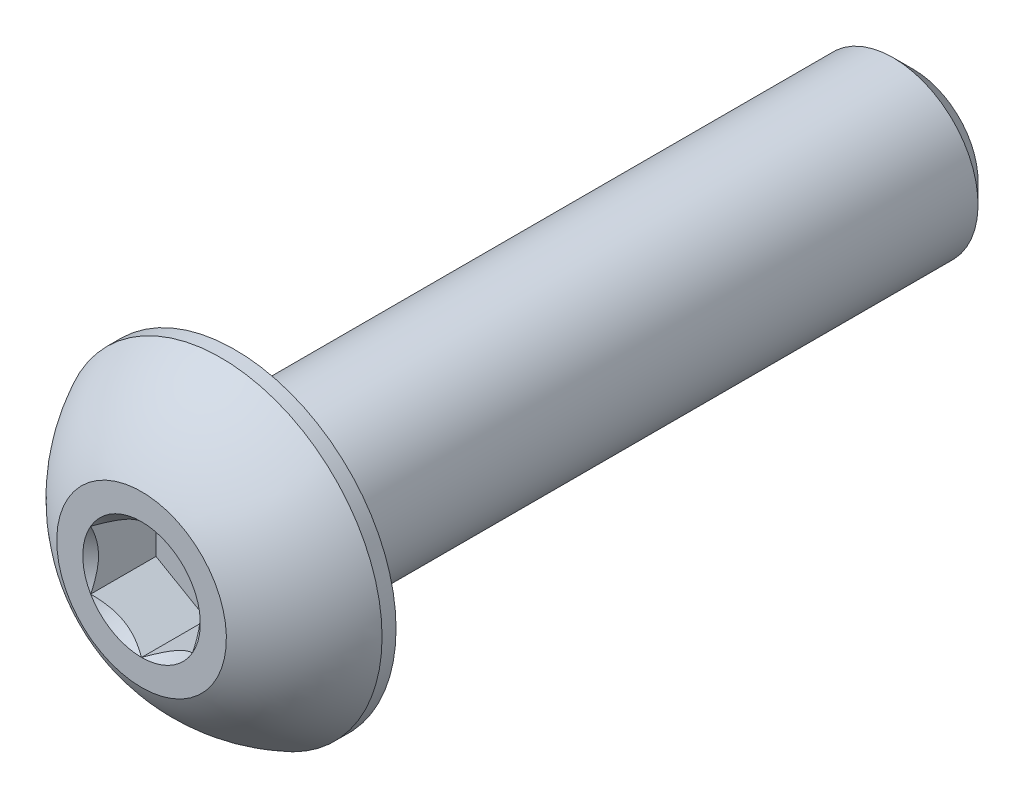
ISO-10303-21;
HEADER;
FILE_DESCRIPTION(('STEP AP214'),'2;1');
FILE_NAME('part.step','',(''),(''),'','','');
FILE_SCHEMA(('AUTOMOTIVE_DESIGN { 1 0 10303 214 1 1 1 1 }'));
ENDSEC;
DATA;
#1=APPLICATION_CONTEXT('core data for automotive mechanical design processes');
#2=APPLICATION_PROTOCOL_DEFINITION('international standard','automotive_design',2000,#1);
#3=PRODUCT_CONTEXT('',#1,'mechanical');
#4=PRODUCT('Part','Part','',(#3));
#5=PRODUCT_RELATED_PRODUCT_CATEGORY('part','',(#4));
#6=PRODUCT_DEFINITION_FORMATION('','',#4);
#7=PRODUCT_DEFINITION_CONTEXT('part definition',#1,'design');
#8=PRODUCT_DEFINITION('design','',#6,#7);
#9=PRODUCT_DEFINITION_SHAPE('','',#8);
#10=(LENGTH_UNIT() NAMED_UNIT(*) SI_UNIT(.MILLI.,.METRE.));
#11=(NAMED_UNIT(*) PLANE_ANGLE_UNIT() SI_UNIT($,.RADIAN.));
#12=(NAMED_UNIT(*) SI_UNIT($,.STERADIAN.) SOLID_ANGLE_UNIT());
#13=UNCERTAINTY_MEASURE_WITH_UNIT(LENGTH_MEASURE(1.E-05),#10,'distance_accuracy_value','');
#14=(GEOMETRIC_REPRESENTATION_CONTEXT(3) GLOBAL_UNCERTAINTY_ASSIGNED_CONTEXT((#13)) GLOBAL_UNIT_ASSIGNED_CONTEXT((#10,
#11,#12)) REPRESENTATION_CONTEXT('',''));
#15=CARTESIAN_POINT('',(0.,0.,0.));
#16=DIRECTION('',(0.,0.,1.));
#17=DIRECTION('',(1.,0.,0.));
#18=AXIS2_PLACEMENT_3D('',#15,#16,#17);
#19=CARTESIAN_POINT('',(0.,-2.5,-22.75));
#20=DIRECTION('',(0.,0.,-1.));
#21=DIRECTION('',(0.,1.,0.));
#22=AXIS2_PLACEMENT_3D('',#19,#20,#21);
#23=PLANE('',#22);
#24=CARTESIAN_POINT('',(0.,0.,-22.75));
#25=DIRECTION('',(0.,0.,-1.));
#26=DIRECTION('',(0.,1.,0.));
#27=AXIS2_PLACEMENT_3D('',#24,#25,#26);
#28=CIRCLE('',#27,1.9);
#29=CARTESIAN_POINT('',(0.,1.9,-22.75));
#30=VERTEX_POINT('',#29);
#31=EDGE_CURVE('E175',#30,#30,#28,.T.);
#32=ORIENTED_EDGE('',*,*,#31,.T.);
#33=EDGE_LOOP('',(#32));
#34=FACE_BOUND('',#33,.T.);
#35=ADVANCED_FACE('F35',(#34),#23,.T.);
#36=CARTESIAN_POINT('',(0.,0.,-22.75));
#37=DIRECTION('',(0.,0.,-1.));
#38=DIRECTION('',(0.,1.,0.));
#39=AXIS2_PLACEMENT_3D('',#36,#37,#38);
#40=CYLINDRICAL_SURFACE('',#39,2.5);
#41=CARTESIAN_POINT('',(0.,0.,-22.15));
#42=DIRECTION('',(0.,0.,-1.));
#43=DIRECTION('',(0.,1.,0.));
#44=AXIS2_PLACEMENT_3D('',#41,#42,#43);
#45=CIRCLE('',#44,2.5);
#46=CARTESIAN_POINT('',(0.,2.5,-22.15));
#47=VERTEX_POINT('',#46);
#48=EDGE_CURVE('E49',#47,#47,#45,.F.);
#49=ORIENTED_EDGE('',*,*,#48,.T.);
#50=EDGE_LOOP('',(#49));
#51=FACE_BOUND('',#50,.T.);
#52=CARTESIAN_POINT('',(0.,0.,-2.75));
#53=DIRECTION('',(0.,0.,1.));
#54=DIRECTION('',(1.,0.,0.));
#55=AXIS2_PLACEMENT_3D('',#52,#53,#54);
#56=CIRCLE('',#55,2.5);
#57=CARTESIAN_POINT('',(2.5,0.,-2.75));
#58=VERTEX_POINT('',#57);
#59=EDGE_CURVE('E172',#58,#58,#56,.F.);
#60=ORIENTED_EDGE('',*,*,#59,.T.);
#61=EDGE_LOOP('',(#60));
#62=FACE_BOUND('',#61,.T.);
#63=ADVANCED_FACE('F180',(#51,#62),#40,.T.);
#64=CARTESIAN_POINT('',(0.,0.,-22.75));
#65=DIRECTION('',(0.,0.,1.));
#66=DIRECTION('',(0.,-1.,0.));
#67=AXIS2_PLACEMENT_3D('',#64,#65,#66);
#68=CONICAL_SURFACE('',#67,1.9,0.785398163397447);
#69=ORIENTED_EDGE('',*,*,#48,.F.);
#70=EDGE_LOOP('',(#69));
#71=FACE_BOUND('',#70,.T.);
#72=ORIENTED_EDGE('',*,*,#31,.F.);
#73=EDGE_LOOP('',(#72));
#74=FACE_BOUND('',#73,.T.);
#75=ADVANCED_FACE('F37',(#71,#74),#68,.T.);
#76=CARTESIAN_POINT('',(0.,0.,-4.65805481283422));
#77=DIRECTION('',(0.,0.,1.));
#78=DIRECTION('',(0.,-1.,0.));
#79=AXIS2_PLACEMENT_3D('',#76,#77,#78);
#80=SPHERICAL_SURFACE('',#79,5.28653711226622);
#81=CARTESIAN_POINT('',(0.,0.,0.));
#82=DIRECTION('',(0.,0.,1.));
#83=DIRECTION('',(1.,0.,0.));
#84=AXIS2_PLACEMENT_3D('',#81,#82,#83);
#85=CIRCLE('',#84,2.5);
#86=CARTESIAN_POINT('',(0.,-2.5,0.));
#87=VERTEX_POINT('',#86);
#88=EDGE_CURVE('E169',#87,#87,#85,.T.);
#89=CARTESIAN_POINT('',(0.,0.,-2.3375));
#90=DIRECTION('',(0.,0.,1.));
#91=DIRECTION('',(1.,0.,0.));
#92=AXIS2_PLACEMENT_3D('',#89,#90,#91);
#93=CIRCLE('',#92,4.75);
#94=CARTESIAN_POINT('',(0.,-4.75,-2.3375));
#95=VERTEX_POINT('',#94);
#96=EDGE_CURVE('E163',#95,#95,#93,.T.);
#97=CARTESIAN_POINT('',(0.,-2.5,0.));
#98=CARTESIAN_POINT('',(0.,-2.53026679982017,-0.016244282455609));
#99=CARTESIAN_POINT('',(0.,-2.56037522904968,-0.0327836412064128));
#100=CARTESIAN_POINT('',(0.,-2.62026400427657,-0.0664460518821871));
#101=CARTESIAN_POINT('',(0.,-2.65004435027396,-0.0835691038071575));
#102=CARTESIAN_POINT('',(0.,-2.70926561698584,-0.11839244141504));
#103=CARTESIAN_POINT('',(0.,-2.73870653770032,-0.136092727097952));
#104=CARTESIAN_POINT('',(0.,-2.79723777417103,-0.172063794044945));
#105=CARTESIAN_POINT('',(0.,-2.82632808992726,-0.190334575309027));
#106=CARTESIAN_POINT('',(0.,-2.8841470610759,-0.227439694392676));
#107=CARTESIAN_POINT('',(0.,-2.91287571646831,-0.246274032212244));
#108=CARTESIAN_POINT('',(0.,-2.96996045130294,-0.284499106978588));
#109=CARTESIAN_POINT('',(0.,-2.99831653074515,-0.303889843925365));
#110=CARTESIAN_POINT('',(0.,-3.05464533901892,-0.343220349244854));
#111=CARTESIAN_POINT('',(0.,-3.08261806785047,-0.363160117617566));
#112=CARTESIAN_POINT('',(0.,-3.13816954607727,-0.403581109164589));
#113=CARTESIAN_POINT('',(0.,-3.16574829547251,-0.424062332338901));
#114=CARTESIAN_POINT('',(0.,-3.22050133565615,-0.465558451209038));
#115=CARTESIAN_POINT('',(0.,-3.24767562644455,-0.486573346904865));
#116=CARTESIAN_POINT('',(0.,-3.30160942393942,-0.529128825735185));
#117=CARTESIAN_POINT('',(0.,-3.32836893064589,-0.550669408869678));
#118=CARTESIAN_POINT('',(0.,-3.38146299210494,-0.594268077753708));
#119=CARTESIAN_POINT('',(0.,-3.40779754685753,-0.616326163503246));
#120=CARTESIAN_POINT('',(0.,-3.46003169800773,-0.660951456155511));
#121=CARTESIAN_POINT('',(0.,-3.48593129440535,-0.683518663058237));
#122=CARTESIAN_POINT('',(0.,-3.53728568771641,-0.729153623103509));
#123=CARTESIAN_POINT('',(0.,-3.56274048462986,-0.752221376246055));
#124=CARTESIAN_POINT('',(0.,-3.61319560685493,-0.798848663663778));
#125=CARTESIAN_POINT('',(0.,-3.63819593216655,-0.822408197938956));
#126=CARTESIAN_POINT('',(0.,-3.68773261175691,-0.870010095651582));
#127=CARTESIAN_POINT('',(0.,-3.71226896603565,-0.89405245908903));
#128=CARTESIAN_POINT('',(0.,-3.76086838042534,-0.942610879694118));
#129=CARTESIAN_POINT('',(0.,-3.78493144053629,-0.967126936861757));
#130=CARTESIAN_POINT('',(0.,-3.83257512329416,-1.01662342950466));
#131=CARTESIAN_POINT('',(0.,-3.85615574594108,-1.04160386497992));
#132=CARTESIAN_POINT('',(0.,-3.90282559378753,-1.0920196223646));
#133=CARTESIAN_POINT('',(0.,-3.92591481898706,-1.11745494427402));
#134=CARTESIAN_POINT('',(0.,-3.97159309867276,-1.1687708098093));
#135=CARTESIAN_POINT('',(0.,-3.99418215315894,-1.19465135343517));
#136=CARTESIAN_POINT('',(0.,-4.03885150820303,-1.24684782851373));
#137=CARTESIAN_POINT('',(0.,-4.06093180876094,-1.27316375996643));
#138=CARTESIAN_POINT('',(0.,-4.10457526604591,-1.32622101137371));
#139=CARTESIAN_POINT('',(0.,-4.12613842277298,-1.3529623313283));
#140=CARTESIAN_POINT('',(0.,-4.16873939899418,-1.40686019877854));
#141=CARTESIAN_POINT('',(0.,-4.1897772184883,-1.4340167462742));
#142=CARTESIAN_POINT('',(0.,-4.23131952645464,-1.488734750071));
#143=CARTESIAN_POINT('',(0.,-4.25182401492686,-1.51629620637214));
#144=CARTESIAN_POINT('',(0.,-4.29229186971308,-1.5718135551894));
#145=CARTESIAN_POINT('',(0.,-4.31225523602708,-1.59976944770551));
#146=CARTESIAN_POINT('',(0.,-4.35163326096594,-1.65606504649041));
#147=CARTESIAN_POINT('',(0.,-4.3710479195908,-1.6844047527592));
#148=CARTESIAN_POINT('',(0.,-4.40932115213664,-1.74145721073709));
#149=CARTESIAN_POINT('',(0.,-4.42817972605763,-1.77016996244618));
#150=CARTESIAN_POINT('',(0.,-4.46533362339398,-1.82795760128832));
#151=CARTESIAN_POINT('',(0.,-4.48362894680934,-1.85703248842136));
#152=CARTESIAN_POINT('',(0.,-4.51964939166499,-1.91553335033324));
#153=CARTESIAN_POINT('',(0.,-4.53737451310527,-1.94495932511208));
#154=CARTESIAN_POINT('',(0.,-4.57224781803529,-2.00415118173237));
#155=CARTESIAN_POINT('',(0.,-4.58939600152503,-2.03391706357382));
#156=CARTESIAN_POINT('',(0.,-4.62310891815402,-2.09377742234707));
#157=CARTESIAN_POINT('',(0.,-4.63967365129327,-2.12387189927887));
#158=CARTESIAN_POINT('',(0.,-4.67221336026297,-2.18437801974018));
#159=CARTESIAN_POINT('',(0.,-4.68818833609342,-2.21478966326969));
#160=CARTESIAN_POINT('',(0.,-4.71954250823692,-2.27591853680649));
#161=CARTESIAN_POINT('',(0.,-4.73492170454996,-2.30663576681378));
#162=CARTESIAN_POINT('',(0.,-4.75,-2.3375));
#163=B_SPLINE_CURVE_WITH_KNOTS('',3,(#97,#98,#99,#100,#101,#102,#103,#104,#105,#106,#107,#108,
#109,#110,#111,#112,#113,#114,#115,#116,#117,#118,#119,#120,#121,#122,#123,#124,#125,#126,#127,
#128,#129,#130,#131,#132,#133,#134,#135,#136,#137,#138,#139,#140,#141,#142,#143,#144,#145,#146,
#147,#148,#149,#150,#151,#152,#153,#154,#155,#156,#157,#158,#159,#160,#161,#162),.UNSPECIFIED.,
.F.,.F.,(4,2,2,2,2,2,2,2,2,2,2,2,2,2,2,2,2,2,2,2,2,2,2,2,2,2,2,2,2,2,2,2,4),(0.,
0.10304982363783,0.206099647275662,0.309149470913491,0.412199294551322,0.515249118189152,
0.618298941826983,0.721348765464812,0.824398589102643,0.927448412740473,1.0304982363783,
1.13354806001613,1.23659788365396,1.33964770729179,1.44269753092962,1.54574735456745,
1.64879717820529,1.75184700184312,1.85489682548095,1.95794664911878,2.06099647275661,
2.16404629639444,2.26709612003227,2.3701459436701,2.47319576730793,2.57624559094576,
2.67929541458359,2.78234523822142,2.88539506185925,2.98844488549708,3.09149470913491,
3.19454453277274,3.29759435641057),.UNSPECIFIED.);
#164=EDGE_CURVE('BSEAM185',#87,#95,#163,.T.);
#165=ORIENTED_EDGE('',*,*,#88,.F.);
#166=ORIENTED_EDGE('',*,*,#96,.T.);
#167=ORIENTED_EDGE('',*,*,#164,.T.);
#168=ORIENTED_EDGE('',*,*,#164,.F.);
#169=EDGE_LOOP('',(#165,#167,#166,#168));
#170=FACE_BOUND('',#169,.T.);
#171=ADVANCED_FACE('F185',(#170),#80,.T.);
#172=CARTESIAN_POINT('',(0.,-2.5,0.));
#173=DIRECTION('',(0.,0.,-1.));
#174=DIRECTION('',(-1.,0.,0.));
#175=AXIS2_PLACEMENT_3D('',#172,#173,#174);
#176=PLANE('',#175);
#177=CARTESIAN_POINT('',(0.,0.,0.));
#178=DIRECTION('',(0.,0.,1.));
#179=DIRECTION('',(1.,0.,0.));
#180=AXIS2_PLACEMENT_3D('',#177,#178,#179);
#181=CIRCLE('',#180,1.73205080756888);
#182=CARTESIAN_POINT('',(-1.5,0.866025403784438,0.));
#183=VERTEX_POINT('',#182);
#184=CARTESIAN_POINT('',(-1.5,-0.866025403784439,0.));
#185=VERTEX_POINT('',#184);
#186=EDGE_CURVE('E62',#183,#185,#181,.T.);
#187=ORIENTED_EDGE('',*,*,#186,.F.);
#188=CARTESIAN_POINT('',(0.,1.73205080756888,0.));
#189=VERTEX_POINT('',#188);
#190=EDGE_CURVE('E134',#189,#183,#181,.T.);
#191=ORIENTED_EDGE('',*,*,#190,.F.);
#192=CARTESIAN_POINT('',(1.5,0.866025403784439,0.));
#193=VERTEX_POINT('',#192);
#194=EDGE_CURVE('E131',#193,#189,#181,.T.);
#195=ORIENTED_EDGE('',*,*,#194,.F.);
#196=CARTESIAN_POINT('',(1.5,-0.866025403784439,0.));
#197=VERTEX_POINT('',#196);
#198=EDGE_CURVE('E102',#197,#193,#181,.T.);
#199=ORIENTED_EDGE('',*,*,#198,.F.);
#200=CARTESIAN_POINT('',(0.,-1.73205080756888,0.));
#201=VERTEX_POINT('',#200);
#202=EDGE_CURVE('E94',#201,#197,#181,.T.);
#203=ORIENTED_EDGE('',*,*,#202,.F.);
#204=EDGE_CURVE('E55',#185,#201,#181,.T.);
#205=ORIENTED_EDGE('',*,*,#204,.F.);
#206=EDGE_LOOP('',(#187,#191,#195,#199,#203,#205));
#207=FACE_BOUND('',#206,.T.);
#208=ORIENTED_EDGE('',*,*,#88,.T.);
#209=EDGE_LOOP('',(#208));
#210=FACE_BOUND('',#209,.T.);
#211=ADVANCED_FACE('F128',(#207,#210),#176,.F.);
#212=CARTESIAN_POINT('',(0.,-4.75,-2.75));
#213=DIRECTION('',(0.,0.,1.));
#214=DIRECTION('',(1.,0.,0.));
#215=AXIS2_PLACEMENT_3D('',#212,#213,#214);
#216=PLANE('',#215);
#217=ORIENTED_EDGE('',*,*,#59,.F.);
#218=EDGE_LOOP('',(#217));
#219=FACE_BOUND('',#218,.T.);
#220=CARTESIAN_POINT('',(0.,0.,-2.75));
#221=DIRECTION('',(0.,0.,1.));
#222=DIRECTION('',(1.,0.,0.));
#223=AXIS2_PLACEMENT_3D('',#220,#221,#222);
#224=CIRCLE('',#223,4.75);
#225=CARTESIAN_POINT('',(4.75,0.,-2.75));
#226=VERTEX_POINT('',#225);
#227=EDGE_CURVE('E166',#226,#226,#224,.T.);
#228=ORIENTED_EDGE('',*,*,#227,.F.);
#229=EDGE_LOOP('',(#228));
#230=FACE_BOUND('',#229,.T.);
#231=ADVANCED_FACE('F199',(#219,#230),#216,.F.);
#232=CARTESIAN_POINT('',(0.,0.,0.));
#233=DIRECTION('',(0.,0.,1.));
#234=DIRECTION('',(1.,0.,0.));
#235=AXIS2_PLACEMENT_3D('',#232,#233,#234);
#236=CYLINDRICAL_SURFACE('',#235,4.75);
#237=ORIENTED_EDGE('',*,*,#96,.F.);
#238=EDGE_LOOP('',(#237));
#239=FACE_BOUND('',#238,.T.);
#240=ORIENTED_EDGE('',*,*,#227,.T.);
#241=EDGE_LOOP('',(#240));
#242=FACE_BOUND('',#241,.T.);
#243=ADVANCED_FACE('F202',(#239,#242),#236,.T.);
#244=CARTESIAN_POINT('',(0.,0.,0.));
#245=DIRECTION('',(0.,0.,1.));
#246=DIRECTION('',(1.,0.,0.));
#247=AXIS2_PLACEMENT_3D('',#244,#245,#246);
#248=CONICAL_SURFACE('',#247,1.73205080756888,0.78539816339745);
#249=ORIENTED_EDGE('',*,*,#198,.T.);
#250=CARTESIAN_POINT('',(1.5,-1.72720812969692,0.555578516270791));
#251=CARTESIAN_POINT('',(1.5,-1.68515175699268,0.523829907857426));
#252=CARTESIAN_POINT('',(1.5,-1.64286104748673,0.492392593807383));
#253=CARTESIAN_POINT('',(1.5,-1.55771581035942,0.430269087556409));
#254=CARTESIAN_POINT('',(1.5,-1.51486114386668,0.399583085892202));
#255=CARTESIAN_POINT('',(1.5,-1.3846813415127,0.30840719242716));
#256=CARTESIAN_POINT('',(1.5,-1.29637976071654,0.249288343426773));
#257=CARTESIAN_POINT('',(1.5,-1.11121478730467,0.133230996316504));
#258=CARTESIAN_POINT('',(1.5,-1.01415038238167,0.0766095587330078));
#259=CARTESIAN_POINT('',(1.5,-0.815173408897605,-0.0269631187343472));
#260=CARTESIAN_POINT('',(1.5,-0.713278669253285,-0.0739469584583305));
#261=CARTESIAN_POINT('',(1.5,-0.560333774943111,-0.13142733156917));
#262=CARTESIAN_POINT('',(1.5,-0.511547982948042,-0.147924612242751));
#263=CARTESIAN_POINT('',(1.5,-0.412798620136866,-0.177002487072996));
#264=CARTESIAN_POINT('',(1.5,-0.362834968437562,-0.189582811405981));
#265=CARTESIAN_POINT('',(1.5,-0.262863235444982,-0.20996380585323));
#266=CARTESIAN_POINT('',(1.5,-0.212872113808022,-0.21784636725402));
#267=CARTESIAN_POINT('',(1.5,-0.112355243569545,-0.228677936030997));
#268=CARTESIAN_POINT('',(1.5,-0.0618295883726279,-0.231627791475649));
#269=CARTESIAN_POINT('',(1.5,0.037429173332384,-0.23237514227515));
#270=CARTESIAN_POINT('',(1.5,0.0861609672002989,-0.230355266441925));
#271=CARTESIAN_POINT('',(1.5,0.183206937768827,-0.221677447103242));
#272=CARTESIAN_POINT('',(1.5,0.231521073438269,-0.215019053031544));
#273=CARTESIAN_POINT('',(1.5,0.328199853425435,-0.197314755877433));
#274=CARTESIAN_POINT('',(1.5,0.376550616310328,-0.186194188742961));
#275=CARTESIAN_POINT('',(1.5,0.472195697125598,-0.160156585951288));
#276=CARTESIAN_POINT('',(1.5,0.51949010309274,-0.145239867959065));
#277=CARTESIAN_POINT('',(1.5,0.668391282696624,-0.0926647764039276));
#278=CARTESIAN_POINT('',(1.5,0.767878709508552,-0.0490187125280247));
#279=CARTESIAN_POINT('',(1.5,0.962179866690724,0.048022994593097));
#280=CARTESIAN_POINT('',(1.5,1.05697519961444,0.101453665089533));
#281=CARTESIAN_POINT('',(1.5,1.23814273533383,0.211685852004558));
#282=CARTESIAN_POINT('',(1.5,1.3246994218129,0.268187920698596));
#283=CARTESIAN_POINT('',(1.5,1.45222331290673,0.355534301578659));
#284=CARTESIAN_POINT('',(1.5,1.49418091978756,0.384957758680043));
#285=CARTESIAN_POINT('',(1.5,1.57752272931476,0.444582821830463));
#286=CARTESIAN_POINT('',(1.5,1.61890708647354,0.474784211664437));
#287=CARTESIAN_POINT('',(1.5,1.66005278019494,0.505308178609455));
#288=B_SPLINE_CURVE_WITH_KNOTS('',3,(#250,#251,#252,#253,#254,#255,#256,#257,#258,#259,#260,
#261,#262,#263,#264,#265,#266,#267,#268,#269,#270,#271,#272,#273,#274,#275,#276,#277,#278,#279,
#280,#281,#282,#283,#284,#285,#286,#287),.UNSPECIFIED.,.F.,.F.,(4,2,2,2,2,2,2,2,2,2,2,2,2,2,2,2,
2,2,4),(0.,0.158079548982668,0.316198780993942,0.634850417346958,0.97169031136151,
1.30737131660667,1.46173961127089,1.61611853740677,1.7677210142141,1.91929742368538,
2.065387412096,2.21149159305544,2.36014984633872,2.50879566386709,2.83376031422673,
3.15991186985652,3.46985601802197,3.62358896039974,3.7772796264207),.UNSPECIFIED.);
#289=EDGE_CURVE('E11',#197,#193,#288,.T.);
#290=ORIENTED_EDGE('',*,*,#289,.F.);
#291=EDGE_LOOP('',(#249,#290));
#292=FACE_BOUND('',#291,.T.);
#293=ADVANCED_FACE('F106',(#292),#248,.F.);
#294=ORIENTED_EDGE('',*,*,#194,.T.);
#295=CARTESIAN_POINT('',(1.5002,0.865909933730601,0.000115481600073575));
#296=CARTESIAN_POINT('',(1.44863220926292,0.895682611594166,-0.0296345239326721));
#297=CARTESIAN_POINT('',(1.3962020823348,0.925953159489765,-0.0576375160896874));
#298=CARTESIAN_POINT('',(1.2892909659444,0.987678321317124,-0.108910769559858));
#299=CARTESIAN_POINT('',(1.23479980418534,1.01913880822718,-0.132152494955627));
#300=CARTESIAN_POINT('',(1.12492091864275,1.08257741237344,-0.17196627100778));
#301=CARTESIAN_POINT('',(1.0695611909048,1.11453936608521,-0.188638414329104));
#302=CARTESIAN_POINT('',(0.957622742522848,1.1791670593912,-0.214325543181897));
#303=CARTESIAN_POINT('',(0.90104744344699,1.21183082354213,-0.223359709521134));
#304=CARTESIAN_POINT('',(0.803544610483558,1.26812411040032,-0.231510918773148));
#305=CARTESIAN_POINT('',(0.762743091719533,1.29168087824208,-0.232717747010783));
#306=CARTESIAN_POINT('',(0.68121203038414,1.33875285845138,-0.230685942837733));
#307=CARTESIAN_POINT('',(0.640482505685369,1.36226806050018,-0.227446329251692));
#308=CARTESIAN_POINT('',(0.559415597836583,1.40907206156905,-0.216708014018038));
#309=CARTESIAN_POINT('',(0.51907861540171,1.43236062923612,-0.209205346981267));
#310=CARTESIAN_POINT('',(0.439081663085968,1.47854689118997,-0.190348388071709));
#311=CARTESIAN_POINT('',(0.399421991483791,1.50144441326545,-0.178992442981415));
#312=CARTESIAN_POINT('',(0.297836865225514,1.56009461325633,-0.145278352407328));
#313=CARTESIAN_POINT('',(0.23654144629031,1.59548353987866,-0.120378150906633));
#314=CARTESIAN_POINT('',(0.146414371536686,1.64751843074894,-0.0783433467284235));
#315=CARTESIAN_POINT('',(0.116714860092281,1.66466545167617,-0.0635748464409036));
#316=CARTESIAN_POINT('',(0.0578620986162484,1.69864410935691,-0.0326894340598312));
#317=CARTESIAN_POINT('',(0.0287085957793622,1.71547589206761,-0.0165731658782895));
#318=CARTESIAN_POINT('',(-0.000200000000000444,1.73216627762272,0.000115481600073434));
#319=B_SPLINE_CURVE_WITH_KNOTS('',3,(#295,#296,#297,#298,#299,#300,#301,#302,#303,#304,#305,
#306,#307,#308,#309,#310,#311,#312,#313,#314,#315,#316,#317,#318),.UNSPECIFIED.,.F.,.F.,(4,2,2,
2,2,2,2,2,2,2,2,4),(0.,0.199829143693305,0.40082298738239,0.598623720538182,0.795926240188891,
0.937113067959883,1.07833105577193,1.21968061668222,1.36109089931055,1.58570969637566,
1.69770705470964,1.80965120737194),.UNSPECIFIED.);
#320=EDGE_CURVE('E133',#193,#189,#319,.T.);
#321=ORIENTED_EDGE('',*,*,#320,.F.);
#322=EDGE_LOOP('',(#294,#321));
#323=FACE_BOUND('',#322,.T.);
#324=ADVANCED_FACE('F287',(#323),#248,.F.);
#325=ORIENTED_EDGE('',*,*,#190,.T.);
#326=CARTESIAN_POINT('',(0.000199999999999626,1.73216627762272,0.000115481600073681));
#327=CARTESIAN_POINT('',(-0.0513677907370761,1.70239359975915,-0.029634523932672));
#328=CARTESIAN_POINT('',(-0.103797917665201,1.67212305186355,-0.0576375160896872));
#329=CARTESIAN_POINT('',(-0.210709034055597,1.61039789003619,-0.108910769559857));
#330=CARTESIAN_POINT('',(-0.265200195814661,1.57893740312614,-0.132152494955627));
#331=CARTESIAN_POINT('',(-0.375079081357249,1.51549879897987,-0.17196627100778));
#332=CARTESIAN_POINT('',(-0.4304388090952,1.4835368452681,-0.188638414329104));
#333=CARTESIAN_POINT('',(-0.542377257477151,1.41890915196211,-0.214325543181897));
#334=CARTESIAN_POINT('',(-0.598952556553009,1.38624538781118,-0.223359709521134));
#335=CARTESIAN_POINT('',(-0.696455389516441,1.32995210095299,-0.231510918773148));
#336=CARTESIAN_POINT('',(-0.737256908280467,1.30639533311124,-0.232717747010783));
#337=CARTESIAN_POINT('',(-0.818787969615859,1.25932335290193,-0.230685942837733));
#338=CARTESIAN_POINT('',(-0.859517494314631,1.23580815085313,-0.227446329251693));
#339=CARTESIAN_POINT('',(-0.940584402163417,1.18900414978427,-0.216708014018038));
#340=CARTESIAN_POINT('',(-0.980921384598289,1.16571558211719,-0.209205346981267));
#341=CARTESIAN_POINT('',(-1.06091833691403,1.11952932016335,-0.19034838807171));
#342=CARTESIAN_POINT('',(-1.10057800851621,1.09663179808786,-0.178992442981415));
#343=CARTESIAN_POINT('',(-1.20216313477449,1.03798159809698,-0.145278352407329));
#344=CARTESIAN_POINT('',(-1.26345855370969,1.00259267147465,-0.120378150906633));
#345=CARTESIAN_POINT('',(-1.35358562846331,0.950557780604374,-0.0783433467284239));
#346=CARTESIAN_POINT('',(-1.38328513990772,0.933410759677147,-0.0635748464409042));
#347=CARTESIAN_POINT('',(-1.44213790138375,0.899432101996406,-0.0326894340598318));
#348=CARTESIAN_POINT('',(-1.47129140422064,0.882600319285709,-0.0165731658782901));
#349=CARTESIAN_POINT('',(-1.5002,0.8659099337306,0.000115481600073071));
#350=B_SPLINE_CURVE_WITH_KNOTS('',3,(#326,#327,#328,#329,#330,#331,#332,#333,#334,#335,#336,
#337,#338,#339,#340,#341,#342,#343,#344,#345,#346,#347,#348,#349),.UNSPECIFIED.,.F.,.F.,(4,2,2,
2,2,2,2,2,2,2,2,4),(0.,0.199829143693305,0.400822987382389,0.598623720538181,0.79592624018889,
0.937113067959882,1.07833105577193,1.21968061668222,1.36109089931055,1.58570969637566,
1.69770705470964,1.80965120737194),.UNSPECIFIED.);
#351=EDGE_CURVE('E138',#189,#183,#350,.T.);
#352=ORIENTED_EDGE('',*,*,#351,.F.);
#353=EDGE_LOOP('',(#325,#352));
#354=FACE_BOUND('',#353,.T.);
#355=ADVANCED_FACE('F141',(#354),#248,.F.);
#356=ORIENTED_EDGE('',*,*,#186,.T.);
#357=CARTESIAN_POINT('',(-1.5,-1.72720812969693,0.555578516270791));
#358=CARTESIAN_POINT('',(-1.5,-1.68515175699268,0.523829907857427));
#359=CARTESIAN_POINT('',(-1.5,-1.64286104748674,0.492392593807383));
#360=CARTESIAN_POINT('',(-1.5,-1.55771581035942,0.430269087556409));
#361=CARTESIAN_POINT('',(-1.5,-1.51486114386668,0.399583085892202));
#362=CARTESIAN_POINT('',(-1.5,-1.3846813415127,0.30840719242716));
#363=CARTESIAN_POINT('',(-1.5,-1.29637976071654,0.249288343426773));
#364=CARTESIAN_POINT('',(-1.5,-1.11121478730467,0.133230996316504));
#365=CARTESIAN_POINT('',(-1.5,-1.01415038238167,0.076609558733008));
#366=CARTESIAN_POINT('',(-1.5,-0.815173408897606,-0.026963118734347));
#367=CARTESIAN_POINT('',(-1.5,-0.713278669253285,-0.0739469584583305));
#368=CARTESIAN_POINT('',(-1.5,-0.560333774943112,-0.13142733156917));
#369=CARTESIAN_POINT('',(-1.5,-0.511547982948042,-0.147924612242751));
#370=CARTESIAN_POINT('',(-1.5,-0.412798620136866,-0.177002487072996));
#371=CARTESIAN_POINT('',(-1.5,-0.362834968437562,-0.189582811405981));
#372=CARTESIAN_POINT('',(-1.5,-0.262863235444982,-0.20996380585323));
#373=CARTESIAN_POINT('',(-1.5,-0.212872113808022,-0.21784636725402));
#374=CARTESIAN_POINT('',(-1.5,-0.112355243569545,-0.228677936030997));
#375=CARTESIAN_POINT('',(-1.5,-0.0618295883726279,-0.231627791475649));
#376=CARTESIAN_POINT('',(-1.5,0.0374291733323841,-0.23237514227515));
#377=CARTESIAN_POINT('',(-1.5,0.0861609672002989,-0.230355266441925));
#378=CARTESIAN_POINT('',(-1.5,0.183206937768827,-0.221677447103242));
#379=CARTESIAN_POINT('',(-1.5,0.231521073438269,-0.215019053031544));
#380=CARTESIAN_POINT('',(-1.5,0.328199853425435,-0.197314755877433));
#381=CARTESIAN_POINT('',(-1.5,0.376550616310328,-0.186194188742961));
#382=CARTESIAN_POINT('',(-1.5,0.472195697125598,-0.160156585951288));
#383=CARTESIAN_POINT('',(-1.5,0.51949010309274,-0.145239867959065));
#384=CARTESIAN_POINT('',(-1.5,0.668391282696624,-0.0926647764039277));
#385=CARTESIAN_POINT('',(-1.5,0.767878709508553,-0.0490187125280249));
#386=CARTESIAN_POINT('',(-1.5,0.962179866690724,0.0480229945930968));
#387=CARTESIAN_POINT('',(-1.5,1.05697519961444,0.101453665089533));
#388=CARTESIAN_POINT('',(-1.5,1.23814273533383,0.211685852004558));
#389=CARTESIAN_POINT('',(-1.5,1.3246994218129,0.268187920698596));
#390=CARTESIAN_POINT('',(-1.5,1.45222331290673,0.355534301578659));
#391=CARTESIAN_POINT('',(-1.5,1.49418091978756,0.384957758680043));
#392=CARTESIAN_POINT('',(-1.5,1.57752272931476,0.444582821830464));
#393=CARTESIAN_POINT('',(-1.5,1.61890708647354,0.474784211664437));
#394=CARTESIAN_POINT('',(-1.5,1.66005278019494,0.505308178609456));
#395=B_SPLINE_CURVE_WITH_KNOTS('',3,(#357,#358,#359,#360,#361,#362,#363,#364,#365,#366,#367,
#368,#369,#370,#371,#372,#373,#374,#375,#376,#377,#378,#379,#380,#381,#382,#383,#384,#385,#386,
#387,#388,#389,#390,#391,#392,#393,#394),.UNSPECIFIED.,.F.,.F.,(4,2,2,2,2,2,2,2,2,2,2,2,2,2,2,2,
2,2,4),(0.,0.158079548982669,0.316198780993942,0.634850417346958,0.97169031136151,
1.30737131660667,1.46173961127089,1.61611853740677,1.7677210142141,1.91929742368538,
2.065387412096,2.21149159305544,2.36014984633872,2.5087956638671,2.83376031422673,
3.15991186985652,3.46985601802198,3.62358896039974,3.7772796264207),.UNSPECIFIED.);
#396=EDGE_CURVE('E145',#183,#185,#395,.F.);
#397=ORIENTED_EDGE('',*,*,#396,.F.);
#398=EDGE_LOOP('',(#356,#397));
#399=FACE_BOUND('',#398,.T.);
#400=ADVANCED_FACE('F281',(#399),#248,.F.);
#401=ORIENTED_EDGE('',*,*,#204,.T.);
#402=CARTESIAN_POINT('',(-1.5002,-0.865909933730601,0.000115481600073141));
#403=CARTESIAN_POINT('',(-1.44863220926292,-0.895682611594166,-0.0296345239326724));
#404=CARTESIAN_POINT('',(-1.3962020823348,-0.925953159489765,-0.0576375160896875));
#405=CARTESIAN_POINT('',(-1.2892909659444,-0.987678321317124,-0.108910769559857));
#406=CARTESIAN_POINT('',(-1.23479980418534,-1.01913880822718,-0.132152494955627));
#407=CARTESIAN_POINT('',(-1.12492091864275,-1.08257741237344,-0.17196627100778));
#408=CARTESIAN_POINT('',(-1.0695611909048,-1.11453936608521,-0.188638414329104));
#409=CARTESIAN_POINT('',(-0.957622742522849,-1.1791670593912,-0.214325543181897));
#410=CARTESIAN_POINT('',(-0.901047443446991,-1.21183082354213,-0.223359709521134));
#411=CARTESIAN_POINT('',(-0.803544610483559,-1.26812411040032,-0.231510918773148));
#412=CARTESIAN_POINT('',(-0.762743091719534,-1.29168087824208,-0.232717747010783));
#413=CARTESIAN_POINT('',(-0.681212030384142,-1.33875285845138,-0.230685942837733));
#414=CARTESIAN_POINT('',(-0.64048250568537,-1.36226806050018,-0.227446329251692));
#415=CARTESIAN_POINT('',(-0.559415597836584,-1.40907206156905,-0.216708014018038));
#416=CARTESIAN_POINT('',(-0.519078615401712,-1.43236062923612,-0.209205346981267));
#417=CARTESIAN_POINT('',(-0.439081663085969,-1.47854689118996,-0.19034838807171));
#418=CARTESIAN_POINT('',(-0.399421991483792,-1.50144441326545,-0.178992442981415));
#419=CARTESIAN_POINT('',(-0.297836865225515,-1.56009461325633,-0.145278352407329));
#420=CARTESIAN_POINT('',(-0.236541446290311,-1.59548353987866,-0.120378150906633));
#421=CARTESIAN_POINT('',(-0.146414371536686,-1.64751843074894,-0.0783433467284236));
#422=CARTESIAN_POINT('',(-0.116714860092282,-1.66466545167617,-0.0635748464409036));
#423=CARTESIAN_POINT('',(-0.0578620986162485,-1.69864410935691,-0.0326894340598309));
#424=CARTESIAN_POINT('',(-0.0287085957793622,-1.71547589206761,-0.0165731658782891));
#425=CARTESIAN_POINT('',(0.000200000000000573,-1.73216627762272,0.000115481600073829));
#426=B_SPLINE_CURVE_WITH_KNOTS('',3,(#402,#403,#404,#405,#406,#407,#408,#409,#410,#411,#412,
#413,#414,#415,#416,#417,#418,#419,#420,#421,#422,#423,#424,#425),.UNSPECIFIED.,.F.,.F.,(4,2,2,
2,2,2,2,2,2,2,2,4),(0.,0.199829143693305,0.400822987382389,0.598623720538181,0.795926240188889,
0.937113067959881,1.07833105577193,1.21968061668222,1.36109089931054,1.58570969637565,
1.69770705470964,1.80965120737194),.UNSPECIFIED.);
#427=EDGE_CURVE('E118',#185,#201,#426,.T.);
#428=ORIENTED_EDGE('',*,*,#427,.F.);
#429=EDGE_LOOP('',(#401,#428));
#430=FACE_BOUND('',#429,.T.);
#431=ADVANCED_FACE('F229',(#430),#248,.F.);
#432=ORIENTED_EDGE('',*,*,#202,.T.);
#433=CARTESIAN_POINT('',(-0.00019999999999946,-1.73216627762272,0.000115481600073879));
#434=CARTESIAN_POINT('',(0.0513677907370762,-1.70239359975915,-0.0296345239326719));
#435=CARTESIAN_POINT('',(0.103797917665201,-1.67212305186355,-0.0576375160896871));
#436=CARTESIAN_POINT('',(0.210709034055597,-1.61039789003619,-0.108910769559857));
#437=CARTESIAN_POINT('',(0.265200195814661,-1.57893740312614,-0.132152494955627));
#438=CARTESIAN_POINT('',(0.375079081357249,-1.51549879897987,-0.17196627100778));
#439=CARTESIAN_POINT('',(0.4304388090952,-1.4835368452681,-0.188638414329103));
#440=CARTESIAN_POINT('',(0.542377257477151,-1.41890915196211,-0.214325543181897));
#441=CARTESIAN_POINT('',(0.598952556553009,-1.38624538781118,-0.223359709521134));
#442=CARTESIAN_POINT('',(0.696455389516441,-1.32995210095299,-0.231510918773148));
#443=CARTESIAN_POINT('',(0.737256908280467,-1.30639533311124,-0.232717747010783));
#444=CARTESIAN_POINT('',(0.818787969615859,-1.25932335290193,-0.230685942837732));
#445=CARTESIAN_POINT('',(0.859517494314631,-1.23580815085313,-0.227446329251692));
#446=CARTESIAN_POINT('',(0.940584402163417,-1.18900414978427,-0.216708014018038));
#447=CARTESIAN_POINT('',(0.980921384598289,-1.16571558211719,-0.209205346981267));
#448=CARTESIAN_POINT('',(1.06091833691403,-1.11952932016335,-0.190348388071709));
#449=CARTESIAN_POINT('',(1.10057800851621,-1.09663179808786,-0.178992442981415));
#450=CARTESIAN_POINT('',(1.20216313477449,-1.03798159809698,-0.145278352407328));
#451=CARTESIAN_POINT('',(1.26345855370969,-1.00259267147465,-0.120378150906633));
#452=CARTESIAN_POINT('',(1.35358562846331,-0.950557780604374,-0.0783433467284236));
#453=CARTESIAN_POINT('',(1.38328513990772,-0.933410759677147,-0.0635748464409038));
#454=CARTESIAN_POINT('',(1.44213790138375,-0.899432101996406,-0.0326894340598314));
#455=CARTESIAN_POINT('',(1.47129140422064,-0.88260031928571,-0.0165731658782898));
#456=CARTESIAN_POINT('',(1.5002,-0.865909933730601,0.000115481600073133));
#457=B_SPLINE_CURVE_WITH_KNOTS('',3,(#433,#434,#435,#436,#437,#438,#439,#440,#441,#442,#443,
#444,#445,#446,#447,#448,#449,#450,#451,#452,#453,#454,#455,#456),.UNSPECIFIED.,.F.,.F.,(4,2,2,
2,2,2,2,2,2,2,2,4),(0.,0.199829143693305,0.400822987382389,0.598623720538181,0.79592624018889,
0.937113067959882,1.07833105577193,1.21968061668222,1.36109089931054,1.58570969637565,
1.69770705470964,1.80965120737194),.UNSPECIFIED.);
#458=EDGE_CURVE('E98',#201,#197,#457,.T.);
#459=ORIENTED_EDGE('',*,*,#458,.F.);
#460=EDGE_LOOP('',(#432,#459));
#461=FACE_BOUND('',#460,.T.);
#462=ADVANCED_FACE('F96',(#461),#248,.F.);
#463=CARTESIAN_POINT('',(1.5,-0.866025403784438,-1.925));
#464=DIRECTION('',(0.,0.,1.));
#465=DIRECTION('',(1.,0.,0.));
#466=AXIS2_PLACEMENT_3D('',#463,#464,#465);
#467=PLANE('',#466);
#468=DIRECTION('',(0.866025403784438,0.5,0.));
#469=VECTOR('',#468,1.);
#470=CARTESIAN_POINT('',(0.,-1.73205080756888,-1.925));
#471=LINE('',#470,#469);
#472=CARTESIAN_POINT('',(0.,-1.73205080756888,-1.925));
#473=VERTEX_POINT('',#472);
#474=CARTESIAN_POINT('',(1.5,-0.866025403784438,-1.925));
#475=VERTEX_POINT('',#474);
#476=EDGE_CURVE('E117',#473,#475,#471,.T.);
#477=ORIENTED_EDGE('',*,*,#476,.T.);
#478=DIRECTION('',(0.,1.,0.));
#479=VECTOR('',#478,1.);
#480=CARTESIAN_POINT('',(1.5,-0.866025403784438,-1.925));
#481=LINE('',#480,#479);
#482=CARTESIAN_POINT('',(1.5,0.866025403784439,-1.925));
#483=VERTEX_POINT('',#482);
#484=EDGE_CURVE('E122',#475,#483,#481,.T.);
#485=ORIENTED_EDGE('',*,*,#484,.T.);
#486=DIRECTION('',(-0.866025403784439,0.5,0.));
#487=VECTOR('',#486,1.);
#488=CARTESIAN_POINT('',(1.5,0.866025403784439,-1.925));
#489=LINE('',#488,#487);
#490=CARTESIAN_POINT('',(0.,1.73205080756888,-1.925));
#491=VERTEX_POINT('',#490);
#492=EDGE_CURVE('E271',#483,#491,#489,.T.);
#493=ORIENTED_EDGE('',*,*,#492,.T.);
#494=DIRECTION('',(-0.866025403784438,-0.5,0.));
#495=VECTOR('',#494,1.);
#496=CARTESIAN_POINT('',(0.,1.73205080756888,-1.925));
#497=LINE('',#496,#495);
#498=CARTESIAN_POINT('',(-1.5,0.866025403784438,-1.925));
#499=VERTEX_POINT('',#498);
#500=EDGE_CURVE('E154',#491,#499,#497,.T.);
#501=ORIENTED_EDGE('',*,*,#500,.T.);
#502=DIRECTION('',(0.,-1.,0.));
#503=VECTOR('',#502,1.);
#504=CARTESIAN_POINT('',(-1.5,0.866025403784438,-1.925));
#505=LINE('',#504,#503);
#506=CARTESIAN_POINT('',(-1.5,-0.866025403784439,-1.925));
#507=VERTEX_POINT('',#506);
#508=EDGE_CURVE('E275',#499,#507,#505,.T.);
#509=ORIENTED_EDGE('',*,*,#508,.T.);
#510=DIRECTION('',(0.866025403784439,-0.5,0.));
#511=VECTOR('',#510,1.);
#512=CARTESIAN_POINT('',(-1.5,-0.866025403784439,-1.925));
#513=LINE('',#512,#511);
#514=EDGE_CURVE('E125',#507,#473,#513,.T.);
#515=ORIENTED_EDGE('',*,*,#514,.T.);
#516=EDGE_LOOP('',(#477,#485,#493,#501,#509,#515));
#517=FACE_BOUND('',#516,.T.);
#518=ADVANCED_FACE('F228',(#517),#467,.T.);
#519=CARTESIAN_POINT('',(1.5,-0.866025403784438,-1.925));
#520=DIRECTION('',(1.,0.,0.));
#521=DIRECTION('',(0.,0.,-1.));
#522=AXIS2_PLACEMENT_3D('',#519,#520,#521);
#523=PLANE('',#522);
#524=DIRECTION('',(0.,0.,1.));
#525=VECTOR('',#524,1.);
#526=CARTESIAN_POINT('',(1.5,-0.866025403784438,-1.925));
#527=LINE('',#526,#525);
#528=EDGE_CURVE('E114',#475,#197,#527,.T.);
#529=ORIENTED_EDGE('',*,*,#528,.T.);
#530=ORIENTED_EDGE('',*,*,#289,.T.);
#531=DIRECTION('',(0.,0.,1.));
#532=VECTOR('',#531,1.);
#533=CARTESIAN_POINT('',(1.5,0.866025403784439,-1.925));
#534=LINE('',#533,#532);
#535=EDGE_CURVE('E124',#483,#193,#534,.T.);
#536=ORIENTED_EDGE('',*,*,#535,.F.);
#537=ORIENTED_EDGE('',*,*,#484,.F.);
#538=EDGE_LOOP('',(#529,#530,#536,#537));
#539=FACE_BOUND('',#538,.T.);
#540=ADVANCED_FACE('F120',(#539),#523,.F.);
#541=CARTESIAN_POINT('',(1.5,0.866025403784439,-1.925));
#542=DIRECTION('',(0.5,0.866025403784439,0.));
#543=DIRECTION('',(-0.866025403784439,0.5,0.));
#544=AXIS2_PLACEMENT_3D('',#541,#542,#543);
#545=PLANE('',#544);
#546=ORIENTED_EDGE('',*,*,#535,.T.);
#547=ORIENTED_EDGE('',*,*,#320,.T.);
#548=DIRECTION('',(0.,0.,1.));
#549=VECTOR('',#548,1.);
#550=CARTESIAN_POINT('',(0.,1.73205080756888,-1.925));
#551=LINE('',#550,#549);
#552=EDGE_CURVE('E150',#491,#189,#551,.T.);
#553=ORIENTED_EDGE('',*,*,#552,.F.);
#554=ORIENTED_EDGE('',*,*,#492,.F.);
#555=EDGE_LOOP('',(#546,#547,#553,#554));
#556=FACE_BOUND('',#555,.T.);
#557=ADVANCED_FACE('F148',(#556),#545,.F.);
#558=CARTESIAN_POINT('',(0.,1.73205080756888,-1.925));
#559=DIRECTION('',(-0.5,0.866025403784438,0.));
#560=DIRECTION('',(-0.866025403784438,-0.5,0.));
#561=AXIS2_PLACEMENT_3D('',#558,#559,#560);
#562=PLANE('',#561);
#563=ORIENTED_EDGE('',*,*,#552,.T.);
#564=ORIENTED_EDGE('',*,*,#351,.T.);
#565=DIRECTION('',(0.,0.,1.));
#566=VECTOR('',#565,1.);
#567=CARTESIAN_POINT('',(-1.5,0.866025403784438,-1.925));
#568=LINE('',#567,#566);
#569=EDGE_CURVE('E156',#499,#183,#568,.T.);
#570=ORIENTED_EDGE('',*,*,#569,.F.);
#571=ORIENTED_EDGE('',*,*,#500,.F.);
#572=EDGE_LOOP('',(#563,#564,#570,#571));
#573=FACE_BOUND('',#572,.T.);
#574=ADVANCED_FACE('F152',(#573),#562,.F.);
#575=CARTESIAN_POINT('',(-1.5,0.866025403784438,-1.925));
#576=DIRECTION('',(-1.,0.,0.));
#577=DIRECTION('',(0.,0.,1.));
#578=AXIS2_PLACEMENT_3D('',#575,#576,#577);
#579=PLANE('',#578);
#580=ORIENTED_EDGE('',*,*,#569,.T.);
#581=ORIENTED_EDGE('',*,*,#396,.T.);
#582=DIRECTION('',(0.,0.,1.));
#583=VECTOR('',#582,1.);
#584=CARTESIAN_POINT('',(-1.5,-0.866025403784439,-1.925));
#585=LINE('',#584,#583);
#586=EDGE_CURVE('E158',#507,#185,#585,.T.);
#587=ORIENTED_EDGE('',*,*,#586,.F.);
#588=ORIENTED_EDGE('',*,*,#508,.F.);
#589=EDGE_LOOP('',(#580,#581,#587,#588));
#590=FACE_BOUND('',#589,.T.);
#591=ADVANCED_FACE('F250',(#590),#579,.F.);
#592=CARTESIAN_POINT('',(-1.5,-0.866025403784439,-1.925));
#593=DIRECTION('',(-0.5,-0.866025403784439,0.));
#594=DIRECTION('',(0.866025403784439,-0.5,0.));
#595=AXIS2_PLACEMENT_3D('',#592,#593,#594);
#596=PLANE('',#595);
#597=ORIENTED_EDGE('',*,*,#586,.T.);
#598=ORIENTED_EDGE('',*,*,#427,.T.);
#599=DIRECTION('',(0.,0.,1.));
#600=VECTOR('',#599,1.);
#601=CARTESIAN_POINT('',(0.,-1.73205080756888,-1.925));
#602=LINE('',#601,#600);
#603=EDGE_CURVE('E116',#473,#201,#602,.T.);
#604=ORIENTED_EDGE('',*,*,#603,.F.);
#605=ORIENTED_EDGE('',*,*,#514,.F.);
#606=EDGE_LOOP('',(#597,#598,#604,#605));
#607=FACE_BOUND('',#606,.T.);
#608=ADVANCED_FACE('F209',(#607),#596,.F.);
#609=CARTESIAN_POINT('',(0.,-1.73205080756888,-1.925));
#610=DIRECTION('',(0.5,-0.866025403784438,0.));
#611=DIRECTION('',(0.866025403784438,0.5,0.));
#612=AXIS2_PLACEMENT_3D('',#609,#610,#611);
#613=PLANE('',#612);
#614=ORIENTED_EDGE('',*,*,#603,.T.);
#615=ORIENTED_EDGE('',*,*,#458,.T.);
#616=ORIENTED_EDGE('',*,*,#528,.F.);
#617=ORIENTED_EDGE('',*,*,#476,.F.);
#618=EDGE_LOOP('',(#614,#615,#616,#617));
#619=FACE_BOUND('',#618,.T.);
#620=ADVANCED_FACE('F112',(#619),#613,.F.);
#621=CLOSED_SHELL('',(#35,#63,#75,#171,#211,#231,#243,#293,#324,#355,#400,#431,#462,#518,#540,
#557,#574,#591,#608,#620));
#622=MANIFOLD_SOLID_BREP('B2',#621);
#623=ADVANCED_BREP_SHAPE_REPRESENTATION('',(#18,#622),#14);
#624=SHAPE_DEFINITION_REPRESENTATION(#9,#623);
ENDSEC;
END-ISO-10303-21;
